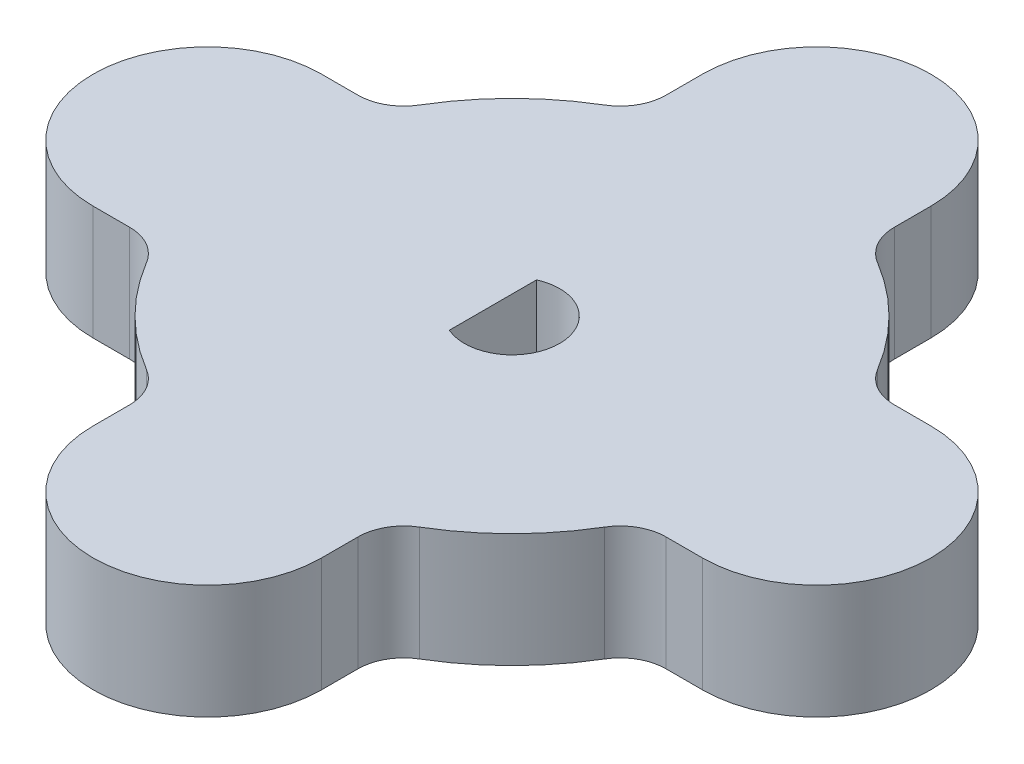
ISO-10303-21;
HEADER;
FILE_DESCRIPTION(('STEP AP214'),'2;1');
FILE_NAME('part.step','',(''),(''),'','','');
FILE_SCHEMA(('AUTOMOTIVE_DESIGN { 1 0 10303 214 1 1 1 1 }'));
ENDSEC;
DATA;
#1=APPLICATION_CONTEXT('core data for automotive mechanical design processes');
#2=APPLICATION_PROTOCOL_DEFINITION('international standard','automotive_design',2000,#1);
#3=PRODUCT_CONTEXT('',#1,'mechanical');
#4=PRODUCT('Part','Part','',(#3));
#5=PRODUCT_RELATED_PRODUCT_CATEGORY('part','',(#4));
#6=PRODUCT_DEFINITION_FORMATION('','',#4);
#7=PRODUCT_DEFINITION_CONTEXT('part definition',#1,'design');
#8=PRODUCT_DEFINITION('design','',#6,#7);
#9=PRODUCT_DEFINITION_SHAPE('','',#8);
#10=(LENGTH_UNIT() NAMED_UNIT(*) SI_UNIT(.MILLI.,.METRE.));
#11=(NAMED_UNIT(*) PLANE_ANGLE_UNIT() SI_UNIT($,.RADIAN.));
#12=(NAMED_UNIT(*) SI_UNIT($,.STERADIAN.) SOLID_ANGLE_UNIT());
#13=UNCERTAINTY_MEASURE_WITH_UNIT(LENGTH_MEASURE(1.E-05),#10,'distance_accuracy_value','');
#14=(GEOMETRIC_REPRESENTATION_CONTEXT(3) GLOBAL_UNCERTAINTY_ASSIGNED_CONTEXT((#13)) GLOBAL_UNIT_ASSIGNED_CONTEXT((#10,
#11,#12)) REPRESENTATION_CONTEXT('',''));
#15=CARTESIAN_POINT('',(0.,0.,0.));
#16=DIRECTION('',(0.,0.,1.));
#17=DIRECTION('',(1.,0.,0.));
#18=AXIS2_PLACEMENT_3D('',#15,#16,#17);
#19=CARTESIAN_POINT('',(-12.9578143582773,9.525,-0.60848417920522));
#20=DIRECTION('',(0.,-1.,0.));
#21=DIRECTION('',(0.,0.,-1.));
#22=AXIS2_PLACEMENT_3D('',#19,#20,#21);
#23=CYLINDRICAL_SURFACE('',#22,22.225);
#24=CARTESIAN_POINT('',(-12.9578143582773,0.,-0.60848417920522));
#25=DIRECTION('',(0.,1.,0.));
#26=DIRECTION('',(0.,0.,1.));
#27=AXIS2_PLACEMENT_3D('',#24,#25,#26);
#28=CIRCLE('',#27,22.225);
#29=CARTESIAN_POINT('',(-24.3413509436432,0.,-19.6968502645892));
#30=VERTEX_POINT('',#29);
#31=CARTESIAN_POINT('',(-32.0461804436613,0.,-11.9920207645711));
#32=VERTEX_POINT('',#31);
#33=EDGE_CURVE('E223',#30,#32,#28,.T.);
#34=ORIENTED_EDGE('',*,*,#33,.T.);
#35=DIRECTION('',(0.,-1.,0.));
#36=VECTOR('',#35,1.);
#37=CARTESIAN_POINT('',(-32.0461804436613,9.525,-11.9920207645711));
#38=LINE('',#37,#36);
#39=CARTESIAN_POINT('',(-32.0461804436613,9.525,-11.9920207645711));
#40=VERTEX_POINT('',#39);
#41=EDGE_CURVE('E337',#32,#40,#38,.F.);
#42=ORIENTED_EDGE('',*,*,#41,.T.);
#43=CARTESIAN_POINT('',(-12.9578143582773,9.525,-0.60848417920522));
#44=DIRECTION('',(0.,1.,0.));
#45=DIRECTION('',(0.,0.,1.));
#46=AXIS2_PLACEMENT_3D('',#43,#44,#45);
#47=CIRCLE('',#46,22.225);
#48=CARTESIAN_POINT('',(-24.3413509436432,9.525,-19.6968502645892));
#49=VERTEX_POINT('',#48);
#50=EDGE_CURVE('E225',#49,#40,#47,.T.);
#51=ORIENTED_EDGE('',*,*,#50,.F.);
#52=DIRECTION('',(0.,-1.,0.));
#53=VECTOR('',#52,1.);
#54=CARTESIAN_POINT('',(-24.3413509436432,9.525,-19.6968502645892));
#55=LINE('',#54,#53);
#56=EDGE_CURVE('E334',#49,#30,#55,.T.);
#57=ORIENTED_EDGE('',*,*,#56,.T.);
#58=EDGE_LOOP('',(#34,#42,#51,#57));
#59=FACE_BOUND('',#58,.T.);
#60=ADVANCED_FACE('F35',(#59),#23,.T.);
#61=CARTESIAN_POINT('',(0.,9.525,-10.1334841792052));
#62=DIRECTION('',(0.,0.,-1.));
#63=DIRECTION('',(-1.,0.,0.));
#64=AXIS2_PLACEMENT_3D('',#61,#62,#63);
#65=PLANE('',#64);
#66=DIRECTION('',(1.,0.,0.));
#67=VECTOR('',#66,1.);
#68=CARTESIAN_POINT('',(0.,9.525,-10.1334841792052));
#69=LINE('',#68,#67);
#70=CARTESIAN_POINT('',(-38.3578143582773,9.525,-10.1334841792052));
#71=VERTEX_POINT('',#70);
#72=CARTESIAN_POINT('',(-35.3184717725843,9.525,-10.1334841792052));
#73=VERTEX_POINT('',#72);
#74=EDGE_CURVE('E228',#71,#73,#69,.T.);
#75=ORIENTED_EDGE('',*,*,#74,.T.);
#76=DIRECTION('',(0.,-1.,0.));
#77=VECTOR('',#76,1.);
#78=CARTESIAN_POINT('',(-35.3184717725843,9.525,-10.1334841792052));
#79=LINE('',#78,#77);
#80=CARTESIAN_POINT('',(-35.3184717725843,0.,-10.1334841792052));
#81=VERTEX_POINT('',#80);
#82=EDGE_CURVE('E331',#73,#81,#79,.T.);
#83=ORIENTED_EDGE('',*,*,#82,.T.);
#84=DIRECTION('',(1.,0.,0.));
#85=VECTOR('',#84,1.);
#86=CARTESIAN_POINT('',(0.,0.,-10.1334841792052));
#87=LINE('',#86,#85);
#88=CARTESIAN_POINT('',(-38.3578143582773,0.,-10.1334841792052));
#89=VERTEX_POINT('',#88);
#90=EDGE_CURVE('E272',#89,#81,#87,.T.);
#91=ORIENTED_EDGE('',*,*,#90,.F.);
#92=DIRECTION('',(0.,-1.,0.));
#93=VECTOR('',#92,1.);
#94=CARTESIAN_POINT('',(-38.3578143582773,9.525,-10.1334841792052));
#95=LINE('',#94,#93);
#96=EDGE_CURVE('E329',#71,#89,#95,.T.);
#97=ORIENTED_EDGE('',*,*,#96,.F.);
#98=EDGE_LOOP('',(#75,#83,#91,#97));
#99=FACE_BOUND('',#98,.T.);
#100=ADVANCED_FACE('F436',(#99),#65,.T.);
#101=CARTESIAN_POINT('',(-38.3578143582773,9.525,-0.608484179205218));
#102=DIRECTION('',(0.,-1.,0.));
#103=DIRECTION('',(0.,0.,-1.));
#104=AXIS2_PLACEMENT_3D('',#101,#102,#103);
#105=CYLINDRICAL_SURFACE('',#104,9.525);
#106=CARTESIAN_POINT('',(-38.3578143582773,0.,-0.608484179205218));
#107=DIRECTION('',(0.,1.,0.));
#108=DIRECTION('',(0.,0.,1.));
#109=AXIS2_PLACEMENT_3D('',#106,#107,#108);
#110=CIRCLE('',#109,9.525);
#111=CARTESIAN_POINT('',(-38.3578143582773,0.,8.91651582079478));
#112=VERTEX_POINT('',#111);
#113=EDGE_CURVE('E275',#89,#112,#110,.T.);
#114=ORIENTED_EDGE('',*,*,#113,.T.);
#115=DIRECTION('',(0.,-1.,0.));
#116=VECTOR('',#115,1.);
#117=CARTESIAN_POINT('',(-38.3578143582773,9.525,8.91651582079478));
#118=LINE('',#117,#116);
#119=CARTESIAN_POINT('',(-38.3578143582773,9.525,8.91651582079478));
#120=VERTEX_POINT('',#119);
#121=EDGE_CURVE('E326',#120,#112,#118,.T.);
#122=ORIENTED_EDGE('',*,*,#121,.F.);
#123=CARTESIAN_POINT('',(-38.3578143582773,9.525,-0.608484179205218));
#124=DIRECTION('',(0.,1.,0.));
#125=DIRECTION('',(0.,0.,1.));
#126=AXIS2_PLACEMENT_3D('',#123,#124,#125);
#127=CIRCLE('',#126,9.525);
#128=EDGE_CURVE('E232',#71,#120,#127,.T.);
#129=ORIENTED_EDGE('',*,*,#128,.F.);
#130=ORIENTED_EDGE('',*,*,#96,.T.);
#131=EDGE_LOOP('',(#114,#122,#129,#130));
#132=FACE_BOUND('',#131,.T.);
#133=ADVANCED_FACE('F443',(#132),#105,.T.);
#134=CARTESIAN_POINT('',(0.,9.525,8.91651582079478));
#135=DIRECTION('',(0.,0.,-1.));
#136=DIRECTION('',(-1.,0.,0.));
#137=AXIS2_PLACEMENT_3D('',#134,#135,#136);
#138=PLANE('',#137);
#139=DIRECTION('',(1.,0.,0.));
#140=VECTOR('',#139,1.);
#141=CARTESIAN_POINT('',(0.,0.,8.91651582079478));
#142=LINE('',#141,#140);
#143=CARTESIAN_POINT('',(-35.3184717725843,0.,8.91651582079478));
#144=VERTEX_POINT('',#143);
#145=EDGE_CURVE('E277',#112,#144,#142,.T.);
#146=ORIENTED_EDGE('',*,*,#145,.T.);
#147=DIRECTION('',(0.,1.,0.));
#148=VECTOR('',#147,1.);
#149=CARTESIAN_POINT('',(-35.3184717725843,9.525,8.91651582079478));
#150=LINE('',#149,#148);
#151=CARTESIAN_POINT('',(-35.3184717725843,9.525,8.91651582079478));
#152=VERTEX_POINT('',#151);
#153=EDGE_CURVE('E349',#144,#152,#150,.T.);
#154=ORIENTED_EDGE('',*,*,#153,.T.);
#155=DIRECTION('',(1.,0.,0.));
#156=VECTOR('',#155,1.);
#157=CARTESIAN_POINT('',(0.,9.525,8.91651582079478));
#158=LINE('',#157,#156);
#159=EDGE_CURVE('E234',#120,#152,#158,.T.);
#160=ORIENTED_EDGE('',*,*,#159,.F.);
#161=ORIENTED_EDGE('',*,*,#121,.T.);
#162=EDGE_LOOP('',(#146,#154,#160,#161));
#163=FACE_BOUND('',#162,.T.);
#164=ADVANCED_FACE('F446',(#163),#138,.F.);
#165=CARTESIAN_POINT('',(-12.9578143582773,9.525,-0.60848417920522));
#166=DIRECTION('',(0.,-1.,0.));
#167=DIRECTION('',(0.,0.,-1.));
#168=AXIS2_PLACEMENT_3D('',#165,#166,#167);
#169=CYLINDRICAL_SURFACE('',#168,22.225);
#170=CARTESIAN_POINT('',(-12.9578143582773,0.,-0.60848417920522));
#171=DIRECTION('',(0.,1.,0.));
#172=DIRECTION('',(0.,0.,1.));
#173=AXIS2_PLACEMENT_3D('',#170,#171,#172);
#174=CIRCLE('',#173,22.225);
#175=CARTESIAN_POINT('',(-32.0461804436613,0.,10.7750524061606));
#176=VERTEX_POINT('',#175);
#177=CARTESIAN_POINT('',(-24.3413509436432,0.,18.4798819061788));
#178=VERTEX_POINT('',#177);
#179=EDGE_CURVE('E280',#176,#178,#174,.T.);
#180=ORIENTED_EDGE('',*,*,#179,.T.);
#181=DIRECTION('',(0.,-1.,0.));
#182=VECTOR('',#181,1.);
#183=CARTESIAN_POINT('',(-24.3413509436432,9.525,18.4798819061788));
#184=LINE('',#183,#182);
#185=CARTESIAN_POINT('',(-24.3413509436432,9.525,18.4798819061788));
#186=VERTEX_POINT('',#185);
#187=EDGE_CURVE('E347',#178,#186,#184,.F.);
#188=ORIENTED_EDGE('',*,*,#187,.T.);
#189=CARTESIAN_POINT('',(-12.9578143582773,9.525,-0.60848417920522));
#190=DIRECTION('',(0.,1.,0.));
#191=DIRECTION('',(0.,0.,1.));
#192=AXIS2_PLACEMENT_3D('',#189,#190,#191);
#193=CIRCLE('',#192,22.225);
#194=CARTESIAN_POINT('',(-32.0461804436613,9.525,10.7750524061606));
#195=VERTEX_POINT('',#194);
#196=EDGE_CURVE('E237',#195,#186,#193,.T.);
#197=ORIENTED_EDGE('',*,*,#196,.F.);
#198=DIRECTION('',(0.,-1.,0.));
#199=VECTOR('',#198,1.);
#200=CARTESIAN_POINT('',(-32.0461804436613,9.525,10.7750524061606));
#201=LINE('',#200,#199);
#202=EDGE_CURVE('E344',#195,#176,#201,.T.);
#203=ORIENTED_EDGE('',*,*,#202,.T.);
#204=EDGE_LOOP('',(#180,#188,#197,#203));
#205=FACE_BOUND('',#204,.T.);
#206=ADVANCED_FACE('F454',(#205),#169,.T.);
#207=CARTESIAN_POINT('',(-22.4828143582773,9.525,0.));
#208=DIRECTION('',(1.,0.,0.));
#209=DIRECTION('',(0.,0.,-1.));
#210=AXIS2_PLACEMENT_3D('',#207,#208,#209);
#211=PLANE('',#210);
#212=DIRECTION('',(0.,0.,1.));
#213=VECTOR('',#212,1.);
#214=CARTESIAN_POINT('',(-22.4828143582773,9.525,0.));
#215=LINE('',#214,#213);
#216=CARTESIAN_POINT('',(-22.4828143582773,9.525,21.7521732351017));
#217=VERTEX_POINT('',#216);
#218=CARTESIAN_POINT('',(-22.4828143582773,9.525,24.7915158207948));
#219=VERTEX_POINT('',#218);
#220=EDGE_CURVE('E240',#217,#219,#215,.T.);
#221=ORIENTED_EDGE('',*,*,#220,.F.);
#222=DIRECTION('',(0.,1.,0.));
#223=VECTOR('',#222,1.);
#224=CARTESIAN_POINT('',(-22.4828143582773,0.,21.7521732351017));
#225=LINE('',#224,#223);
#226=CARTESIAN_POINT('',(-22.4828143582773,0.,21.7521732351017));
#227=VERTEX_POINT('',#226);
#228=EDGE_CURVE('E341',#217,#227,#225,.F.);
#229=ORIENTED_EDGE('',*,*,#228,.T.);
#230=DIRECTION('',(0.,0.,1.));
#231=VECTOR('',#230,1.);
#232=CARTESIAN_POINT('',(-22.4828143582773,0.,0.));
#233=LINE('',#232,#231);
#234=CARTESIAN_POINT('',(-22.4828143582773,0.,24.7915158207948));
#235=VERTEX_POINT('',#234);
#236=EDGE_CURVE('E283',#227,#235,#233,.T.);
#237=ORIENTED_EDGE('',*,*,#236,.T.);
#238=DIRECTION('',(0.,-1.,0.));
#239=VECTOR('',#238,1.);
#240=CARTESIAN_POINT('',(-22.4828143582773,9.525,24.7915158207948));
#241=LINE('',#240,#239);
#242=EDGE_CURVE('E323',#219,#235,#241,.T.);
#243=ORIENTED_EDGE('',*,*,#242,.F.);
#244=EDGE_LOOP('',(#221,#229,#237,#243));
#245=FACE_BOUND('',#244,.T.);
#246=ADVANCED_FACE('F464',(#245),#211,.F.);
#247=CARTESIAN_POINT('',(-12.9578143582773,9.525,24.7915158207948));
#248=DIRECTION('',(0.,-1.,0.));
#249=DIRECTION('',(0.,0.,-1.));
#250=AXIS2_PLACEMENT_3D('',#247,#248,#249);
#251=CYLINDRICAL_SURFACE('',#250,9.525);
#252=CARTESIAN_POINT('',(-12.9578143582773,0.,24.7915158207948));
#253=DIRECTION('',(0.,1.,0.));
#254=DIRECTION('',(0.,0.,1.));
#255=AXIS2_PLACEMENT_3D('',#252,#253,#254);
#256=CIRCLE('',#255,9.525);
#257=CARTESIAN_POINT('',(-3.43281435827732,0.,24.7915158207948));
#258=VERTEX_POINT('',#257);
#259=EDGE_CURVE('E285',#258,#235,#256,.F.);
#260=ORIENTED_EDGE('',*,*,#259,.F.);
#261=DIRECTION('',(0.,-1.,0.));
#262=VECTOR('',#261,1.);
#263=CARTESIAN_POINT('',(-3.43281435827732,9.525,24.7915158207948));
#264=LINE('',#263,#262);
#265=CARTESIAN_POINT('',(-3.43281435827732,9.525,24.7915158207948));
#266=VERTEX_POINT('',#265);
#267=EDGE_CURVE('E320',#266,#258,#264,.T.);
#268=ORIENTED_EDGE('',*,*,#267,.F.);
#269=CARTESIAN_POINT('',(-12.9578143582773,9.525,24.7915158207948));
#270=DIRECTION('',(0.,1.,0.));
#271=DIRECTION('',(0.,0.,1.));
#272=AXIS2_PLACEMENT_3D('',#269,#270,#271);
#273=CIRCLE('',#272,9.525);
#274=EDGE_CURVE('E242',#266,#219,#273,.F.);
#275=ORIENTED_EDGE('',*,*,#274,.T.);
#276=ORIENTED_EDGE('',*,*,#242,.T.);
#277=EDGE_LOOP('',(#260,#268,#275,#276));
#278=FACE_BOUND('',#277,.T.);
#279=ADVANCED_FACE('F469',(#278),#251,.T.);
#280=CARTESIAN_POINT('',(-3.43281435827732,9.525,0.));
#281=DIRECTION('',(1.,0.,0.));
#282=DIRECTION('',(0.,0.,-1.));
#283=AXIS2_PLACEMENT_3D('',#280,#281,#282);
#284=PLANE('',#283);
#285=DIRECTION('',(0.,0.,1.));
#286=VECTOR('',#285,1.);
#287=CARTESIAN_POINT('',(-3.43281435827732,0.,0.));
#288=LINE('',#287,#286);
#289=CARTESIAN_POINT('',(-3.43281435827732,0.,21.7521732351017));
#290=VERTEX_POINT('',#289);
#291=EDGE_CURVE('E288',#290,#258,#288,.T.);
#292=ORIENTED_EDGE('',*,*,#291,.F.);
#293=DIRECTION('',(0.,-1.,0.));
#294=VECTOR('',#293,1.);
#295=CARTESIAN_POINT('',(-3.43281435827732,9.525,21.7521732351017));
#296=LINE('',#295,#294);
#297=CARTESIAN_POINT('',(-3.43281435827732,9.525,21.7521732351017));
#298=VERTEX_POINT('',#297);
#299=EDGE_CURVE('E359',#290,#298,#296,.F.);
#300=ORIENTED_EDGE('',*,*,#299,.T.);
#301=DIRECTION('',(0.,0.,1.));
#302=VECTOR('',#301,1.);
#303=CARTESIAN_POINT('',(-3.43281435827732,9.525,0.));
#304=LINE('',#303,#302);
#305=EDGE_CURVE('E245',#298,#266,#304,.T.);
#306=ORIENTED_EDGE('',*,*,#305,.T.);
#307=ORIENTED_EDGE('',*,*,#267,.T.);
#308=EDGE_LOOP('',(#292,#300,#306,#307));
#309=FACE_BOUND('',#308,.T.);
#310=ADVANCED_FACE('F605',(#309),#284,.T.);
#311=CARTESIAN_POINT('',(-12.9578143582773,9.525,-0.60848417920522));
#312=DIRECTION('',(0.,-1.,0.));
#313=DIRECTION('',(0.,0.,-1.));
#314=AXIS2_PLACEMENT_3D('',#311,#312,#313);
#315=CYLINDRICAL_SURFACE('',#314,22.225);
#316=CARTESIAN_POINT('',(-12.9578143582773,0.,-0.60848417920522));
#317=DIRECTION('',(0.,1.,0.));
#318=DIRECTION('',(0.,0.,1.));
#319=AXIS2_PLACEMENT_3D('',#316,#317,#318);
#320=CIRCLE('',#319,22.225);
#321=CARTESIAN_POINT('',(-1.57427777291147,0.,18.4798819061788));
#322=VERTEX_POINT('',#321);
#323=CARTESIAN_POINT('',(6.13055172710666,0.,10.7750524061606));
#324=VERTEX_POINT('',#323);
#325=EDGE_CURVE('E290',#322,#324,#320,.T.);
#326=ORIENTED_EDGE('',*,*,#325,.T.);
#327=DIRECTION('',(0.,-1.,0.));
#328=VECTOR('',#327,1.);
#329=CARTESIAN_POINT('',(6.13055172710665,9.525,10.7750524061606));
#330=LINE('',#329,#328);
#331=CARTESIAN_POINT('',(6.13055172710666,9.525,10.7750524061606));
#332=VERTEX_POINT('',#331);
#333=EDGE_CURVE('E357',#324,#332,#330,.F.);
#334=ORIENTED_EDGE('',*,*,#333,.T.);
#335=CARTESIAN_POINT('',(-12.9578143582773,9.525,-0.60848417920522));
#336=DIRECTION('',(0.,1.,0.));
#337=DIRECTION('',(0.,0.,1.));
#338=AXIS2_PLACEMENT_3D('',#335,#336,#337);
#339=CIRCLE('',#338,22.225);
#340=CARTESIAN_POINT('',(-1.57427777291147,9.525,18.4798819061788));
#341=VERTEX_POINT('',#340);
#342=EDGE_CURVE('E247',#341,#332,#339,.T.);
#343=ORIENTED_EDGE('',*,*,#342,.F.);
#344=DIRECTION('',(0.,-1.,0.));
#345=VECTOR('',#344,1.);
#346=CARTESIAN_POINT('',(-1.57427777291147,9.525,18.4798819061788));
#347=LINE('',#346,#345);
#348=EDGE_CURVE('E354',#341,#322,#347,.T.);
#349=ORIENTED_EDGE('',*,*,#348,.T.);
#350=EDGE_LOOP('',(#326,#334,#343,#349));
#351=FACE_BOUND('',#350,.T.);
#352=ADVANCED_FACE('F480',(#351),#315,.T.);
#353=CARTESIAN_POINT('',(0.,9.525,8.91651582079478));
#354=DIRECTION('',(0.,0.,-1.));
#355=DIRECTION('',(-1.,0.,0.));
#356=AXIS2_PLACEMENT_3D('',#353,#354,#355);
#357=PLANE('',#356);
#358=DIRECTION('',(1.,0.,0.));
#359=VECTOR('',#358,1.);
#360=CARTESIAN_POINT('',(0.,9.525,8.91651582079478));
#361=LINE('',#360,#359);
#362=CARTESIAN_POINT('',(9.40284305602962,9.525,8.91651582079477));
#363=VERTEX_POINT('',#362);
#364=CARTESIAN_POINT('',(12.4421856417227,9.525,8.91651582079477));
#365=VERTEX_POINT('',#364);
#366=EDGE_CURVE('E250',#363,#365,#361,.T.);
#367=ORIENTED_EDGE('',*,*,#366,.F.);
#368=DIRECTION('',(0.,1.,0.));
#369=VECTOR('',#368,1.);
#370=CARTESIAN_POINT('',(9.40284305602962,0.,8.91651582079477));
#371=LINE('',#370,#369);
#372=CARTESIAN_POINT('',(9.40284305602962,0.,8.91651582079477));
#373=VERTEX_POINT('',#372);
#374=EDGE_CURVE('E351',#363,#373,#371,.F.);
#375=ORIENTED_EDGE('',*,*,#374,.T.);
#376=DIRECTION('',(1.,0.,0.));
#377=VECTOR('',#376,1.);
#378=CARTESIAN_POINT('',(0.,0.,8.91651582079478));
#379=LINE('',#378,#377);
#380=CARTESIAN_POINT('',(12.4421856417227,0.,8.91651582079477));
#381=VERTEX_POINT('',#380);
#382=EDGE_CURVE('E293',#373,#381,#379,.T.);
#383=ORIENTED_EDGE('',*,*,#382,.T.);
#384=DIRECTION('',(0.,-1.,0.));
#385=VECTOR('',#384,1.);
#386=CARTESIAN_POINT('',(12.4421856417227,9.525,8.91651582079477));
#387=LINE('',#386,#385);
#388=EDGE_CURVE('E317',#365,#381,#387,.T.);
#389=ORIENTED_EDGE('',*,*,#388,.F.);
#390=EDGE_LOOP('',(#367,#375,#383,#389));
#391=FACE_BOUND('',#390,.T.);
#392=ADVANCED_FACE('F490',(#391),#357,.F.);
#393=CARTESIAN_POINT('',(12.4421856417227,9.525,-0.608484179205226));
#394=DIRECTION('',(0.,-1.,0.));
#395=DIRECTION('',(0.,0.,-1.));
#396=AXIS2_PLACEMENT_3D('',#393,#394,#395);
#397=CYLINDRICAL_SURFACE('',#396,9.525);
#398=CARTESIAN_POINT('',(12.4421856417227,0.,-0.608484179205226));
#399=DIRECTION('',(0.,1.,0.));
#400=DIRECTION('',(0.,0.,1.));
#401=AXIS2_PLACEMENT_3D('',#398,#399,#400);
#402=CIRCLE('',#401,9.525);
#403=CARTESIAN_POINT('',(12.4421856417227,0.,-10.1334841792052));
#404=VERTEX_POINT('',#403);
#405=EDGE_CURVE('E295',#404,#381,#402,.F.);
#406=ORIENTED_EDGE('',*,*,#405,.F.);
#407=DIRECTION('',(0.,-1.,0.));
#408=VECTOR('',#407,1.);
#409=CARTESIAN_POINT('',(12.4421856417227,9.525,-10.1334841792052));
#410=LINE('',#409,#408);
#411=CARTESIAN_POINT('',(12.4421856417227,9.525,-10.1334841792052));
#412=VERTEX_POINT('',#411);
#413=EDGE_CURVE('E314',#412,#404,#410,.T.);
#414=ORIENTED_EDGE('',*,*,#413,.F.);
#415=CARTESIAN_POINT('',(12.4421856417227,9.525,-0.608484179205226));
#416=DIRECTION('',(0.,1.,0.));
#417=DIRECTION('',(0.,0.,1.));
#418=AXIS2_PLACEMENT_3D('',#415,#416,#417);
#419=CIRCLE('',#418,9.525);
#420=EDGE_CURVE('E252',#412,#365,#419,.F.);
#421=ORIENTED_EDGE('',*,*,#420,.T.);
#422=ORIENTED_EDGE('',*,*,#388,.T.);
#423=EDGE_LOOP('',(#406,#414,#421,#422));
#424=FACE_BOUND('',#423,.T.);
#425=ADVANCED_FACE('F498',(#424),#397,.T.);
#426=CARTESIAN_POINT('',(0.,9.525,-10.1334841792052));
#427=DIRECTION('',(0.,0.,-1.));
#428=DIRECTION('',(-1.,0.,0.));
#429=AXIS2_PLACEMENT_3D('',#426,#427,#428);
#430=PLANE('',#429);
#431=DIRECTION('',(1.,0.,0.));
#432=VECTOR('',#431,1.);
#433=CARTESIAN_POINT('',(0.,0.,-10.1334841792052));
#434=LINE('',#433,#432);
#435=CARTESIAN_POINT('',(9.40284305602961,0.,-10.1334841792052));
#436=VERTEX_POINT('',#435);
#437=EDGE_CURVE('E298',#436,#404,#434,.T.);
#438=ORIENTED_EDGE('',*,*,#437,.F.);
#439=DIRECTION('',(0.,-1.,0.));
#440=VECTOR('',#439,1.);
#441=CARTESIAN_POINT('',(9.40284305602961,9.525,-10.1334841792052));
#442=LINE('',#441,#440);
#443=CARTESIAN_POINT('',(9.40284305602961,9.525,-10.1334841792052));
#444=VERTEX_POINT('',#443);
#445=EDGE_CURVE('E366',#436,#444,#442,.F.);
#446=ORIENTED_EDGE('',*,*,#445,.T.);
#447=DIRECTION('',(1.,0.,0.));
#448=VECTOR('',#447,1.);
#449=CARTESIAN_POINT('',(0.,9.525,-10.1334841792052));
#450=LINE('',#449,#448);
#451=EDGE_CURVE('E255',#444,#412,#450,.T.);
#452=ORIENTED_EDGE('',*,*,#451,.T.);
#453=ORIENTED_EDGE('',*,*,#413,.T.);
#454=EDGE_LOOP('',(#438,#446,#452,#453));
#455=FACE_BOUND('',#454,.T.);
#456=ADVANCED_FACE('F501',(#455),#430,.T.);
#457=CARTESIAN_POINT('',(-12.9578143582773,9.525,-0.60848417920522));
#458=DIRECTION('',(0.,-1.,0.));
#459=DIRECTION('',(0.,0.,-1.));
#460=AXIS2_PLACEMENT_3D('',#457,#458,#459);
#461=CYLINDRICAL_SURFACE('',#460,22.225);
#462=CARTESIAN_POINT('',(-12.9578143582773,9.525,-0.60848417920522));
#463=DIRECTION('',(0.,1.,0.));
#464=DIRECTION('',(0.,0.,1.));
#465=AXIS2_PLACEMENT_3D('',#462,#463,#464);
#466=CIRCLE('',#465,22.225);
#467=CARTESIAN_POINT('',(6.13055172710665,9.525,-11.9920207645711));
#468=VERTEX_POINT('',#467);
#469=CARTESIAN_POINT('',(-1.57427777291147,9.525,-19.6968502645892));
#470=VERTEX_POINT('',#469);
#471=EDGE_CURVE('E257',#468,#470,#466,.T.);
#472=ORIENTED_EDGE('',*,*,#471,.F.);
#473=DIRECTION('',(0.,-1.,0.));
#474=VECTOR('',#473,1.);
#475=CARTESIAN_POINT('',(6.13055172710665,9.525,-11.9920207645711));
#476=LINE('',#475,#474);
#477=CARTESIAN_POINT('',(6.13055172710665,0.,-11.9920207645711));
#478=VERTEX_POINT('',#477);
#479=EDGE_CURVE('E363',#468,#478,#476,.T.);
#480=ORIENTED_EDGE('',*,*,#479,.T.);
#481=CARTESIAN_POINT('',(-12.9578143582773,0.,-0.60848417920522));
#482=DIRECTION('',(0.,1.,0.));
#483=DIRECTION('',(0.,0.,1.));
#484=AXIS2_PLACEMENT_3D('',#481,#482,#483);
#485=CIRCLE('',#484,22.225);
#486=CARTESIAN_POINT('',(-1.57427777291147,0.,-19.6968502645892));
#487=VERTEX_POINT('',#486);
#488=EDGE_CURVE('E300',#478,#487,#485,.T.);
#489=ORIENTED_EDGE('',*,*,#488,.T.);
#490=DIRECTION('',(0.,-1.,0.));
#491=VECTOR('',#490,1.);
#492=CARTESIAN_POINT('',(-1.57427777291147,9.525,-19.6968502645892));
#493=LINE('',#492,#491);
#494=EDGE_CURVE('E361',#487,#470,#493,.F.);
#495=ORIENTED_EDGE('',*,*,#494,.T.);
#496=EDGE_LOOP('',(#472,#480,#489,#495));
#497=FACE_BOUND('',#496,.T.);
#498=ADVANCED_FACE('F406',(#497),#461,.T.);
#499=CARTESIAN_POINT('',(-3.43281435827732,9.525,0.));
#500=DIRECTION('',(1.,0.,0.));
#501=DIRECTION('',(0.,0.,-1.));
#502=AXIS2_PLACEMENT_3D('',#499,#500,#501);
#503=PLANE('',#502);
#504=DIRECTION('',(0.,0.,1.));
#505=VECTOR('',#504,1.);
#506=CARTESIAN_POINT('',(-3.43281435827732,9.525,0.));
#507=LINE('',#506,#505);
#508=CARTESIAN_POINT('',(-3.43281435827732,9.525,-26.0084841792052));
#509=VERTEX_POINT('',#508);
#510=CARTESIAN_POINT('',(-3.43281435827732,9.525,-22.9691415935122));
#511=VERTEX_POINT('',#510);
#512=EDGE_CURVE('E260',#509,#511,#507,.T.);
#513=ORIENTED_EDGE('',*,*,#512,.T.);
#514=DIRECTION('',(0.,-1.,0.));
#515=VECTOR('',#514,1.);
#516=CARTESIAN_POINT('',(-3.43281435827732,9.525,-22.9691415935122));
#517=LINE('',#516,#515);
#518=CARTESIAN_POINT('',(-3.43281435827732,0.,-22.9691415935122));
#519=VERTEX_POINT('',#518);
#520=EDGE_CURVE('E368',#511,#519,#517,.T.);
#521=ORIENTED_EDGE('',*,*,#520,.T.);
#522=DIRECTION('',(0.,0.,1.));
#523=VECTOR('',#522,1.);
#524=CARTESIAN_POINT('',(-3.43281435827732,0.,0.));
#525=LINE('',#524,#523);
#526=CARTESIAN_POINT('',(-3.43281435827732,0.,-26.0084841792052));
#527=VERTEX_POINT('',#526);
#528=EDGE_CURVE('E303',#527,#519,#525,.T.);
#529=ORIENTED_EDGE('',*,*,#528,.F.);
#530=DIRECTION('',(0.,-1.,0.));
#531=VECTOR('',#530,1.);
#532=CARTESIAN_POINT('',(-3.43281435827732,9.525,-26.0084841792052));
#533=LINE('',#532,#531);
#534=EDGE_CURVE('E312',#509,#527,#533,.T.);
#535=ORIENTED_EDGE('',*,*,#534,.F.);
#536=EDGE_LOOP('',(#513,#521,#529,#535));
#537=FACE_BOUND('',#536,.T.);
#538=ADVANCED_FACE('F414',(#537),#503,.T.);
#539=CARTESIAN_POINT('',(-12.9578143582773,9.525,-26.0084841792052));
#540=DIRECTION('',(0.,-1.,0.));
#541=DIRECTION('',(0.,0.,-1.));
#542=AXIS2_PLACEMENT_3D('',#539,#540,#541);
#543=CYLINDRICAL_SURFACE('',#542,9.525);
#544=CARTESIAN_POINT('',(-12.9578143582773,0.,-26.0084841792052));
#545=DIRECTION('',(0.,1.,0.));
#546=DIRECTION('',(0.,0.,1.));
#547=AXIS2_PLACEMENT_3D('',#544,#545,#546);
#548=CIRCLE('',#547,9.525);
#549=CARTESIAN_POINT('',(-22.4828143582773,0.,-26.0084841792052));
#550=VERTEX_POINT('',#549);
#551=EDGE_CURVE('E306',#550,#527,#548,.F.);
#552=ORIENTED_EDGE('',*,*,#551,.F.);
#553=DIRECTION('',(0.,-1.,0.));
#554=VECTOR('',#553,1.);
#555=CARTESIAN_POINT('',(-22.4828143582773,9.525,-26.0084841792052));
#556=LINE('',#555,#554);
#557=CARTESIAN_POINT('',(-22.4828143582773,9.525,-26.0084841792052));
#558=VERTEX_POINT('',#557);
#559=EDGE_CURVE('E269',#558,#550,#556,.T.);
#560=ORIENTED_EDGE('',*,*,#559,.F.);
#561=CARTESIAN_POINT('',(-12.9578143582773,9.525,-26.0084841792052));
#562=DIRECTION('',(0.,1.,0.));
#563=DIRECTION('',(0.,0.,1.));
#564=AXIS2_PLACEMENT_3D('',#561,#562,#563);
#565=CIRCLE('',#564,9.525);
#566=EDGE_CURVE('E263',#558,#509,#565,.F.);
#567=ORIENTED_EDGE('',*,*,#566,.T.);
#568=ORIENTED_EDGE('',*,*,#534,.T.);
#569=EDGE_LOOP('',(#552,#560,#567,#568));
#570=FACE_BOUND('',#569,.T.);
#571=ADVANCED_FACE('F417',(#570),#543,.T.);
#572=CARTESIAN_POINT('',(-22.4828143582773,9.525,0.));
#573=DIRECTION('',(1.,0.,0.));
#574=DIRECTION('',(0.,0.,-1.));
#575=AXIS2_PLACEMENT_3D('',#572,#573,#574);
#576=PLANE('',#575);
#577=DIRECTION('',(0.,0.,1.));
#578=VECTOR('',#577,1.);
#579=CARTESIAN_POINT('',(-22.4828143582773,0.,0.));
#580=LINE('',#579,#578);
#581=CARTESIAN_POINT('',(-22.4828143582773,0.,-22.9691415935122));
#582=VERTEX_POINT('',#581);
#583=EDGE_CURVE('E229',#550,#582,#580,.T.);
#584=ORIENTED_EDGE('',*,*,#583,.T.);
#585=DIRECTION('',(0.,1.,0.));
#586=VECTOR('',#585,1.);
#587=CARTESIAN_POINT('',(-22.4828143582773,9.525,-22.9691415935122));
#588=LINE('',#587,#586);
#589=CARTESIAN_POINT('',(-22.4828143582773,9.525,-22.9691415935122));
#590=VERTEX_POINT('',#589);
#591=EDGE_CURVE('E339',#582,#590,#588,.T.);
#592=ORIENTED_EDGE('',*,*,#591,.T.);
#593=DIRECTION('',(0.,0.,1.));
#594=VECTOR('',#593,1.);
#595=CARTESIAN_POINT('',(-22.4828143582773,9.525,0.));
#596=LINE('',#595,#594);
#597=EDGE_CURVE('E266',#558,#590,#596,.T.);
#598=ORIENTED_EDGE('',*,*,#597,.F.);
#599=ORIENTED_EDGE('',*,*,#559,.T.);
#600=EDGE_LOOP('',(#584,#592,#598,#599));
#601=FACE_BOUND('',#600,.T.);
#602=ADVANCED_FACE('F557',(#601),#576,.F.);
#603=CARTESIAN_POINT('',(0.,9.525,0.));
#604=DIRECTION('',(0.,1.,0.));
#605=DIRECTION('',(0.,0.,1.));
#606=AXIS2_PLACEMENT_3D('',#603,#604,#605);
#607=PLANE('',#606);
#608=DIRECTION('',(0.,0.,1.));
#609=VECTOR('',#608,1.);
#610=CARTESIAN_POINT('',(-14.5453143582773,9.525,0.));
#611=LINE('',#610,#609);
#612=CARTESIAN_POINT('',(-14.5453143582773,9.525,-4.24590363707642));
#613=VERTEX_POINT('',#612);
#614=CARTESIAN_POINT('',(-14.5453143582773,9.525,3.02893527866598));
#615=VERTEX_POINT('',#614);
#616=EDGE_CURVE('E50',#613,#615,#611,.T.);
#617=ORIENTED_EDGE('',*,*,#616,.F.);
#618=CARTESIAN_POINT('',(-12.9578143582773,9.525,-0.60848417920522));
#619=DIRECTION('',(0.,1.,0.));
#620=DIRECTION('',(0.,0.,1.));
#621=AXIS2_PLACEMENT_3D('',#618,#619,#620);
#622=CIRCLE('',#621,3.96875);
#623=EDGE_CURVE('E218',#615,#613,#622,.T.);
#624=ORIENTED_EDGE('',*,*,#623,.F.);
#625=EDGE_LOOP('',(#617,#624));
#626=FACE_BOUND('',#625,.T.);
#627=ORIENTED_EDGE('',*,*,#597,.T.);
#628=CARTESIAN_POINT('',(-26.2928143582773,9.525,-22.9691415935122));
#629=DIRECTION('',(0.,1.,0.));
#630=DIRECTION('',(0.,0.,1.));
#631=AXIS2_PLACEMENT_3D('',#628,#629,#630);
#632=CIRCLE('',#631,3.81);
#633=EDGE_CURVE('E377',#590,#49,#632,.F.);
#634=ORIENTED_EDGE('',*,*,#633,.T.);
#635=ORIENTED_EDGE('',*,*,#50,.T.);
#636=CARTESIAN_POINT('',(-35.3184717725843,9.525,-13.9434841792052));
#637=DIRECTION('',(0.,1.,0.));
#638=DIRECTION('',(0.,0.,1.));
#639=AXIS2_PLACEMENT_3D('',#636,#637,#638);
#640=CIRCLE('',#639,3.81);
#641=EDGE_CURVE('E373',#40,#73,#640,.F.);
#642=ORIENTED_EDGE('',*,*,#641,.T.);
#643=ORIENTED_EDGE('',*,*,#74,.F.);
#644=ORIENTED_EDGE('',*,*,#128,.T.);
#645=ORIENTED_EDGE('',*,*,#159,.T.);
#646=CARTESIAN_POINT('',(-35.3184717725843,9.525,12.7265158207948));
#647=DIRECTION('',(0.,1.,0.));
#648=DIRECTION('',(0.,0.,1.));
#649=AXIS2_PLACEMENT_3D('',#646,#647,#648);
#650=CIRCLE('',#649,3.81);
#651=EDGE_CURVE('E385',#152,#195,#650,.F.);
#652=ORIENTED_EDGE('',*,*,#651,.T.);
#653=ORIENTED_EDGE('',*,*,#196,.T.);
#654=CARTESIAN_POINT('',(-26.2928143582773,9.525,21.7521732351017));
#655=DIRECTION('',(0.,1.,0.));
#656=DIRECTION('',(0.,0.,1.));
#657=AXIS2_PLACEMENT_3D('',#654,#655,#656);
#658=CIRCLE('',#657,3.81);
#659=EDGE_CURVE('E381',#186,#217,#658,.F.);
#660=ORIENTED_EDGE('',*,*,#659,.T.);
#661=ORIENTED_EDGE('',*,*,#220,.T.);
#662=ORIENTED_EDGE('',*,*,#274,.F.);
#663=ORIENTED_EDGE('',*,*,#305,.F.);
#664=CARTESIAN_POINT('',(0.377185641722673,9.525,21.7521732351017));
#665=DIRECTION('',(0.,1.,0.));
#666=DIRECTION('',(0.,0.,1.));
#667=AXIS2_PLACEMENT_3D('',#664,#665,#666);
#668=CIRCLE('',#667,3.81);
#669=EDGE_CURVE('E393',#298,#341,#668,.F.);
#670=ORIENTED_EDGE('',*,*,#669,.T.);
#671=ORIENTED_EDGE('',*,*,#342,.T.);
#672=CARTESIAN_POINT('',(9.40284305602962,9.525,12.7265158207948));
#673=DIRECTION('',(0.,1.,0.));
#674=DIRECTION('',(0.,0.,1.));
#675=AXIS2_PLACEMENT_3D('',#672,#673,#674);
#676=CIRCLE('',#675,3.81);
#677=EDGE_CURVE('E389',#332,#363,#676,.F.);
#678=ORIENTED_EDGE('',*,*,#677,.T.);
#679=ORIENTED_EDGE('',*,*,#366,.T.);
#680=ORIENTED_EDGE('',*,*,#420,.F.);
#681=ORIENTED_EDGE('',*,*,#451,.F.);
#682=CARTESIAN_POINT('',(9.40284305602961,9.525,-13.9434841792052));
#683=DIRECTION('',(0.,1.,0.));
#684=DIRECTION('',(0.,0.,1.));
#685=AXIS2_PLACEMENT_3D('',#682,#683,#684);
#686=CIRCLE('',#685,3.81);
#687=EDGE_CURVE('E397',#444,#468,#686,.F.);
#688=ORIENTED_EDGE('',*,*,#687,.T.);
#689=ORIENTED_EDGE('',*,*,#471,.T.);
#690=CARTESIAN_POINT('',(0.377185641722678,9.525,-22.9691415935122));
#691=DIRECTION('',(0.,1.,0.));
#692=DIRECTION('',(0.,0.,1.));
#693=AXIS2_PLACEMENT_3D('',#690,#691,#692);
#694=CIRCLE('',#693,3.81);
#695=EDGE_CURVE('E11',#470,#511,#694,.F.);
#696=ORIENTED_EDGE('',*,*,#695,.T.);
#697=ORIENTED_EDGE('',*,*,#512,.F.);
#698=ORIENTED_EDGE('',*,*,#566,.F.);
#699=EDGE_LOOP('',(#627,#634,#635,#642,#643,#644,#645,#652,#653,#660,#661,#662,#663,#670,#671,
#678,#679,#680,#681,#688,#689,#696,#697,#698));
#700=FACE_BOUND('',#699,.T.);
#701=ADVANCED_FACE('F411',(#626,#700),#607,.T.);
#702=CARTESIAN_POINT('',(0.,0.,0.));
#703=DIRECTION('',(0.,1.,0.));
#704=DIRECTION('',(0.,0.,1.));
#705=AXIS2_PLACEMENT_3D('',#702,#703,#704);
#706=PLANE('',#705);
#707=CARTESIAN_POINT('',(-12.9578143582773,0.,-0.60848417920522));
#708=DIRECTION('',(0.,1.,0.));
#709=DIRECTION('',(0.,0.,1.));
#710=AXIS2_PLACEMENT_3D('',#707,#708,#709);
#711=CIRCLE('',#710,3.96875);
#712=CARTESIAN_POINT('',(-14.5453143582773,0.,3.02893527866598));
#713=VERTEX_POINT('',#712);
#714=CARTESIAN_POINT('',(-14.5453143582773,0.,-4.24590363707642));
#715=VERTEX_POINT('',#714);
#716=EDGE_CURVE('E210',#713,#715,#711,.T.);
#717=ORIENTED_EDGE('',*,*,#716,.T.);
#718=DIRECTION('',(0.,0.,1.));
#719=VECTOR('',#718,1.);
#720=CARTESIAN_POINT('',(-14.5453143582773,0.,0.));
#721=LINE('',#720,#719);
#722=EDGE_CURVE('E55',#715,#713,#721,.T.);
#723=ORIENTED_EDGE('',*,*,#722,.T.);
#724=EDGE_LOOP('',(#717,#723));
#725=FACE_BOUND('',#724,.T.);
#726=ORIENTED_EDGE('',*,*,#33,.F.);
#727=CARTESIAN_POINT('',(-26.2928143582773,0.,-22.9691415935122));
#728=DIRECTION('',(0.,1.,0.));
#729=DIRECTION('',(0.,0.,1.));
#730=AXIS2_PLACEMENT_3D('',#727,#728,#729);
#731=CIRCLE('',#730,3.81);
#732=EDGE_CURVE('E375',#30,#582,#731,.T.);
#733=ORIENTED_EDGE('',*,*,#732,.T.);
#734=ORIENTED_EDGE('',*,*,#583,.F.);
#735=ORIENTED_EDGE('',*,*,#551,.T.);
#736=ORIENTED_EDGE('',*,*,#528,.T.);
#737=CARTESIAN_POINT('',(0.377185641722678,0.,-22.9691415935122));
#738=DIRECTION('',(0.,1.,0.));
#739=DIRECTION('',(0.,0.,1.));
#740=AXIS2_PLACEMENT_3D('',#737,#738,#739);
#741=CIRCLE('',#740,3.81);
#742=EDGE_CURVE('E43',#519,#487,#741,.T.);
#743=ORIENTED_EDGE('',*,*,#742,.T.);
#744=ORIENTED_EDGE('',*,*,#488,.F.);
#745=CARTESIAN_POINT('',(9.40284305602961,0.,-13.9434841792052));
#746=DIRECTION('',(0.,1.,0.));
#747=DIRECTION('',(0.,0.,1.));
#748=AXIS2_PLACEMENT_3D('',#745,#746,#747);
#749=CIRCLE('',#748,3.81);
#750=EDGE_CURVE('E395',#478,#436,#749,.T.);
#751=ORIENTED_EDGE('',*,*,#750,.T.);
#752=ORIENTED_EDGE('',*,*,#437,.T.);
#753=ORIENTED_EDGE('',*,*,#405,.T.);
#754=ORIENTED_EDGE('',*,*,#382,.F.);
#755=CARTESIAN_POINT('',(9.40284305602962,0.,12.7265158207948));
#756=DIRECTION('',(0.,1.,0.));
#757=DIRECTION('',(0.,0.,1.));
#758=AXIS2_PLACEMENT_3D('',#755,#756,#757);
#759=CIRCLE('',#758,3.81);
#760=EDGE_CURVE('E387',#373,#324,#759,.T.);
#761=ORIENTED_EDGE('',*,*,#760,.T.);
#762=ORIENTED_EDGE('',*,*,#325,.F.);
#763=CARTESIAN_POINT('',(0.377185641722673,0.,21.7521732351017));
#764=DIRECTION('',(0.,1.,0.));
#765=DIRECTION('',(0.,0.,1.));
#766=AXIS2_PLACEMENT_3D('',#763,#764,#765);
#767=CIRCLE('',#766,3.81);
#768=EDGE_CURVE('E391',#322,#290,#767,.T.);
#769=ORIENTED_EDGE('',*,*,#768,.T.);
#770=ORIENTED_EDGE('',*,*,#291,.T.);
#771=ORIENTED_EDGE('',*,*,#259,.T.);
#772=ORIENTED_EDGE('',*,*,#236,.F.);
#773=CARTESIAN_POINT('',(-26.2928143582773,0.,21.7521732351017));
#774=DIRECTION('',(0.,1.,0.));
#775=DIRECTION('',(0.,0.,1.));
#776=AXIS2_PLACEMENT_3D('',#773,#774,#775);
#777=CIRCLE('',#776,3.81);
#778=EDGE_CURVE('E379',#227,#178,#777,.T.);
#779=ORIENTED_EDGE('',*,*,#778,.T.);
#780=ORIENTED_EDGE('',*,*,#179,.F.);
#781=CARTESIAN_POINT('',(-35.3184717725843,0.,12.7265158207948));
#782=DIRECTION('',(0.,1.,0.));
#783=DIRECTION('',(0.,0.,1.));
#784=AXIS2_PLACEMENT_3D('',#781,#782,#783);
#785=CIRCLE('',#784,3.81);
#786=EDGE_CURVE('E383',#176,#144,#785,.T.);
#787=ORIENTED_EDGE('',*,*,#786,.T.);
#788=ORIENTED_EDGE('',*,*,#145,.F.);
#789=ORIENTED_EDGE('',*,*,#113,.F.);
#790=ORIENTED_EDGE('',*,*,#90,.T.);
#791=CARTESIAN_POINT('',(-35.3184717725843,0.,-13.9434841792052));
#792=DIRECTION('',(0.,1.,0.));
#793=DIRECTION('',(0.,0.,1.));
#794=AXIS2_PLACEMENT_3D('',#791,#792,#793);
#795=CIRCLE('',#794,3.81);
#796=EDGE_CURVE('E371',#81,#32,#795,.T.);
#797=ORIENTED_EDGE('',*,*,#796,.T.);
#798=EDGE_LOOP('',(#726,#733,#734,#735,#736,#743,#744,#751,#752,#753,#754,#761,#762,#769,#770,
#771,#772,#779,#780,#787,#788,#789,#790,#797));
#799=FACE_BOUND('',#798,.T.);
#800=ADVANCED_FACE('F216',(#725,#799),#706,.F.);
#801=CARTESIAN_POINT('',(-35.3184717725843,9.525,-13.9434841792052));
#802=DIRECTION('',(0.,-1.,0.));
#803=DIRECTION('',(0.,0.,-1.));
#804=AXIS2_PLACEMENT_3D('',#801,#802,#803);
#805=CYLINDRICAL_SURFACE('',#804,3.81);
#806=ORIENTED_EDGE('',*,*,#641,.F.);
#807=ORIENTED_EDGE('',*,*,#41,.F.);
#808=ORIENTED_EDGE('',*,*,#796,.F.);
#809=ORIENTED_EDGE('',*,*,#82,.F.);
#810=EDGE_LOOP('',(#806,#807,#808,#809));
#811=FACE_BOUND('',#810,.T.);
#812=ADVANCED_FACE('F434',(#811),#805,.F.);
#813=CARTESIAN_POINT('',(-26.2928143582773,9.525,-22.9691415935122));
#814=DIRECTION('',(0.,-1.,0.));
#815=DIRECTION('',(0.,0.,-1.));
#816=AXIS2_PLACEMENT_3D('',#813,#814,#815);
#817=CYLINDRICAL_SURFACE('',#816,3.81);
#818=ORIENTED_EDGE('',*,*,#633,.F.);
#819=ORIENTED_EDGE('',*,*,#591,.F.);
#820=ORIENTED_EDGE('',*,*,#732,.F.);
#821=ORIENTED_EDGE('',*,*,#56,.F.);
#822=EDGE_LOOP('',(#818,#819,#820,#821));
#823=FACE_BOUND('',#822,.T.);
#824=ADVANCED_FACE('F425',(#823),#817,.F.);
#825=CARTESIAN_POINT('',(-26.2928143582773,9.525,21.7521732351017));
#826=DIRECTION('',(0.,-1.,0.));
#827=DIRECTION('',(0.,0.,-1.));
#828=AXIS2_PLACEMENT_3D('',#825,#826,#827);
#829=CYLINDRICAL_SURFACE('',#828,3.81);
#830=ORIENTED_EDGE('',*,*,#659,.F.);
#831=ORIENTED_EDGE('',*,*,#187,.F.);
#832=ORIENTED_EDGE('',*,*,#778,.F.);
#833=ORIENTED_EDGE('',*,*,#228,.F.);
#834=EDGE_LOOP('',(#830,#831,#832,#833));
#835=FACE_BOUND('',#834,.T.);
#836=ADVANCED_FACE('F458',(#835),#829,.F.);
#837=CARTESIAN_POINT('',(-35.3184717725843,9.525,12.7265158207948));
#838=DIRECTION('',(0.,-1.,0.));
#839=DIRECTION('',(0.,0.,-1.));
#840=AXIS2_PLACEMENT_3D('',#837,#838,#839);
#841=CYLINDRICAL_SURFACE('',#840,3.81);
#842=ORIENTED_EDGE('',*,*,#651,.F.);
#843=ORIENTED_EDGE('',*,*,#153,.F.);
#844=ORIENTED_EDGE('',*,*,#786,.F.);
#845=ORIENTED_EDGE('',*,*,#202,.F.);
#846=EDGE_LOOP('',(#842,#843,#844,#845));
#847=FACE_BOUND('',#846,.T.);
#848=ADVANCED_FACE('F449',(#847),#841,.F.);
#849=CARTESIAN_POINT('',(9.40284305602962,9.525,12.7265158207948));
#850=DIRECTION('',(0.,-1.,0.));
#851=DIRECTION('',(0.,0.,-1.));
#852=AXIS2_PLACEMENT_3D('',#849,#850,#851);
#853=CYLINDRICAL_SURFACE('',#852,3.81);
#854=ORIENTED_EDGE('',*,*,#677,.F.);
#855=ORIENTED_EDGE('',*,*,#333,.F.);
#856=ORIENTED_EDGE('',*,*,#760,.F.);
#857=ORIENTED_EDGE('',*,*,#374,.F.);
#858=EDGE_LOOP('',(#854,#855,#856,#857));
#859=FACE_BOUND('',#858,.T.);
#860=ADVANCED_FACE('F487',(#859),#853,.F.);
#861=CARTESIAN_POINT('',(0.377185641722673,9.525,21.7521732351017));
#862=DIRECTION('',(0.,-1.,0.));
#863=DIRECTION('',(0.,0.,-1.));
#864=AXIS2_PLACEMENT_3D('',#861,#862,#863);
#865=CYLINDRICAL_SURFACE('',#864,3.81);
#866=ORIENTED_EDGE('',*,*,#669,.F.);
#867=ORIENTED_EDGE('',*,*,#299,.F.);
#868=ORIENTED_EDGE('',*,*,#768,.F.);
#869=ORIENTED_EDGE('',*,*,#348,.F.);
#870=EDGE_LOOP('',(#866,#867,#868,#869));
#871=FACE_BOUND('',#870,.T.);
#872=ADVANCED_FACE('F477',(#871),#865,.F.);
#873=CARTESIAN_POINT('',(9.40284305602961,9.525,-13.9434841792052));
#874=DIRECTION('',(0.,-1.,0.));
#875=DIRECTION('',(0.,0.,-1.));
#876=AXIS2_PLACEMENT_3D('',#873,#874,#875);
#877=CYLINDRICAL_SURFACE('',#876,3.81);
#878=ORIENTED_EDGE('',*,*,#687,.F.);
#879=ORIENTED_EDGE('',*,*,#445,.F.);
#880=ORIENTED_EDGE('',*,*,#750,.F.);
#881=ORIENTED_EDGE('',*,*,#479,.F.);
#882=EDGE_LOOP('',(#878,#879,#880,#881));
#883=FACE_BOUND('',#882,.T.);
#884=ADVANCED_FACE('F504',(#883),#877,.F.);
#885=CARTESIAN_POINT('',(0.377185641722678,9.525,-22.9691415935122));
#886=DIRECTION('',(0.,-1.,0.));
#887=DIRECTION('',(0.,0.,-1.));
#888=AXIS2_PLACEMENT_3D('',#885,#886,#887);
#889=CYLINDRICAL_SURFACE('',#888,3.81);
#890=ORIENTED_EDGE('',*,*,#695,.F.);
#891=ORIENTED_EDGE('',*,*,#494,.F.);
#892=ORIENTED_EDGE('',*,*,#742,.F.);
#893=ORIENTED_EDGE('',*,*,#520,.F.);
#894=EDGE_LOOP('',(#890,#891,#892,#893));
#895=FACE_BOUND('',#894,.T.);
#896=ADVANCED_FACE('F37',(#895),#889,.F.);
#897=CARTESIAN_POINT('',(-14.5453143582773,0.,0.));
#898=DIRECTION('',(-1.,0.,0.));
#899=DIRECTION('',(0.,0.,1.));
#900=AXIS2_PLACEMENT_3D('',#897,#898,#899);
#901=PLANE('',#900);
#902=ORIENTED_EDGE('',*,*,#616,.T.);
#903=DIRECTION('',(0.,1.,0.));
#904=VECTOR('',#903,1.);
#905=CARTESIAN_POINT('',(-14.5453143582773,0.,3.02893527866598));
#906=LINE('',#905,#904);
#907=EDGE_CURVE('E203',#713,#615,#906,.T.);
#908=ORIENTED_EDGE('',*,*,#907,.F.);
#909=ORIENTED_EDGE('',*,*,#722,.F.);
#910=DIRECTION('',(0.,1.,0.));
#911=VECTOR('',#910,1.);
#912=CARTESIAN_POINT('',(-14.5453143582773,0.,-4.24590363707642));
#913=LINE('',#912,#911);
#914=EDGE_CURVE('E209',#715,#613,#913,.T.);
#915=ORIENTED_EDGE('',*,*,#914,.T.);
#916=EDGE_LOOP('',(#902,#908,#909,#915));
#917=FACE_BOUND('',#916,.T.);
#918=ADVANCED_FACE('F205',(#917),#901,.F.);
#919=CARTESIAN_POINT('',(-12.9578143582773,0.,-0.60848417920522));
#920=DIRECTION('',(0.,1.,0.));
#921=DIRECTION('',(0.,0.,1.));
#922=AXIS2_PLACEMENT_3D('',#919,#920,#921);
#923=CYLINDRICAL_SURFACE('',#922,3.96875);
#924=ORIENTED_EDGE('',*,*,#623,.T.);
#925=ORIENTED_EDGE('',*,*,#914,.F.);
#926=ORIENTED_EDGE('',*,*,#716,.F.);
#927=ORIENTED_EDGE('',*,*,#907,.T.);
#928=EDGE_LOOP('',(#924,#925,#926,#927));
#929=FACE_BOUND('',#928,.T.);
#930=ADVANCED_FACE('F213',(#929),#923,.F.);
#931=CLOSED_SHELL('',(#60,#100,#133,#164,#206,#246,#279,#310,#352,#392,#425,#456,#498,#538,#571,
#602,#701,#800,#812,#824,#836,#848,#860,#872,#884,#896,#918,#930));
#932=MANIFOLD_SOLID_BREP('B2',#931);
#933=ADVANCED_BREP_SHAPE_REPRESENTATION('',(#18,#932),#14);
#934=SHAPE_DEFINITION_REPRESENTATION(#9,#933);
ENDSEC;
END-ISO-10303-21;
